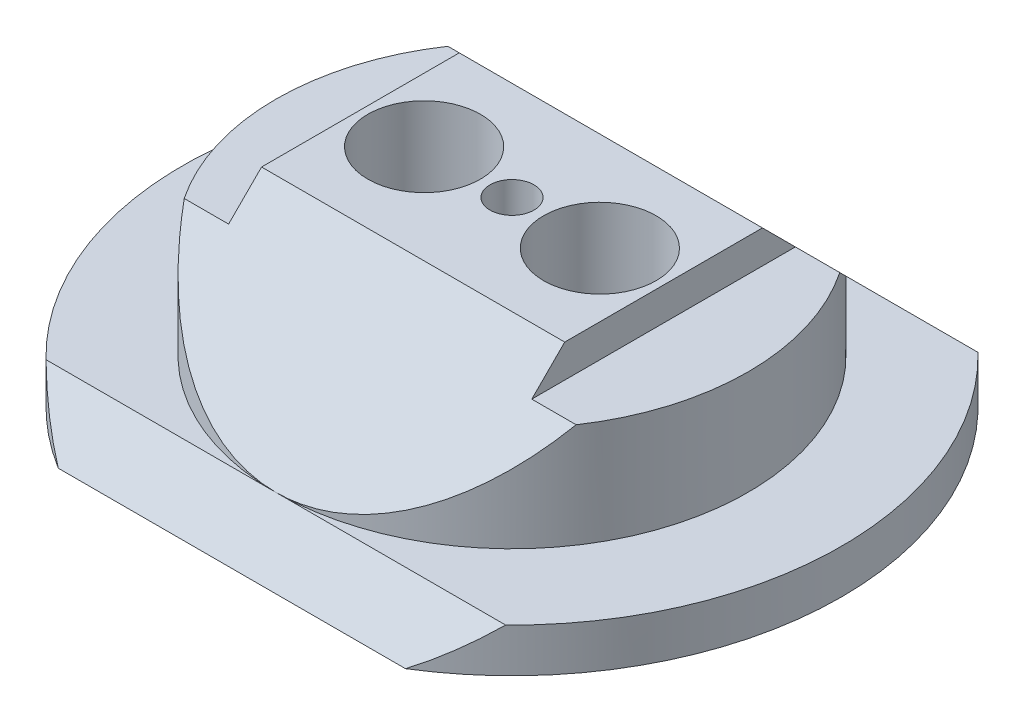
ISO-10303-21;
HEADER;
FILE_DESCRIPTION(('STEP AP214'),'2;1');
FILE_NAME('part.step','',(''),(''),'','','');
FILE_SCHEMA(('AUTOMOTIVE_DESIGN { 1 0 10303 214 1 1 1 1 }'));
ENDSEC;
DATA;
#1=APPLICATION_CONTEXT('core data for automotive mechanical design processes');
#2=APPLICATION_PROTOCOL_DEFINITION('international standard','automotive_design',2000,#1);
#3=PRODUCT_CONTEXT('',#1,'mechanical');
#4=PRODUCT('Part','Part','',(#3));
#5=PRODUCT_RELATED_PRODUCT_CATEGORY('part','',(#4));
#6=PRODUCT_DEFINITION_FORMATION('','',#4);
#7=PRODUCT_DEFINITION_CONTEXT('part definition',#1,'design');
#8=PRODUCT_DEFINITION('design','',#6,#7);
#9=PRODUCT_DEFINITION_SHAPE('','',#8);
#10=(LENGTH_UNIT() NAMED_UNIT(*) SI_UNIT(.MILLI.,.METRE.));
#11=(NAMED_UNIT(*) PLANE_ANGLE_UNIT() SI_UNIT($,.RADIAN.));
#12=(NAMED_UNIT(*) SI_UNIT($,.STERADIAN.) SOLID_ANGLE_UNIT());
#13=UNCERTAINTY_MEASURE_WITH_UNIT(LENGTH_MEASURE(1.E-05),#10,'distance_accuracy_value','');
#14=(GEOMETRIC_REPRESENTATION_CONTEXT(3) GLOBAL_UNCERTAINTY_ASSIGNED_CONTEXT((#13)) GLOBAL_UNIT_ASSIGNED_CONTEXT((#10,
#11,#12)) REPRESENTATION_CONTEXT('',''));
#15=CARTESIAN_POINT('',(0.,0.,0.));
#16=DIRECTION('',(0.,0.,1.));
#17=DIRECTION('',(1.,0.,0.));
#18=AXIS2_PLACEMENT_3D('',#15,#16,#17);
#19=CARTESIAN_POINT('',(0.,20.,0.));
#20=DIRECTION('',(0.,-1.,0.));
#21=DIRECTION('',(0.,0.,-1.));
#22=AXIS2_PLACEMENT_3D('',#19,#20,#21);
#23=CYLINDRICAL_SURFACE('',#22,1.5);
#24=CARTESIAN_POINT('',(0.,0.,0.));
#25=DIRECTION('',(0.,-1.,0.));
#26=DIRECTION('',(0.,0.,-1.));
#27=AXIS2_PLACEMENT_3D('',#24,#25,#26);
#28=CIRCLE('',#27,1.5);
#29=CARTESIAN_POINT('',(0.,0.,-1.5));
#30=VERTEX_POINT('',#29);
#31=EDGE_CURVE('E156',#30,#30,#28,.T.);
#32=ORIENTED_EDGE('',*,*,#31,.T.);
#33=EDGE_LOOP('',(#32));
#34=FACE_BOUND('',#33,.T.);
#35=CARTESIAN_POINT('',(0.,13.5,0.));
#36=DIRECTION('',(0.,1.,0.));
#37=DIRECTION('',(0.,0.,1.));
#38=AXIS2_PLACEMENT_3D('',#35,#36,#37);
#39=CIRCLE('',#38,1.5);
#40=CARTESIAN_POINT('',(0.,13.5,1.5));
#41=VERTEX_POINT('',#40);
#42=EDGE_CURVE('E63',#41,#41,#39,.F.);
#43=ORIENTED_EDGE('',*,*,#42,.F.);
#44=EDGE_LOOP('',(#43));
#45=FACE_BOUND('',#44,.T.);
#46=ADVANCED_FACE('F59',(#34,#45),#23,.F.);
#47=CARTESIAN_POINT('',(0.,0.,0.));
#48=DIRECTION('',(0.,1.,0.));
#49=DIRECTION('',(0.,0.,1.));
#50=AXIS2_PLACEMENT_3D('',#47,#48,#49);
#51=PLANE('',#50);
#52=CARTESIAN_POINT('',(-14.,0.,12.));
#53=DIRECTION('',(0.,-1.,0.));
#54=DIRECTION('',(0.,0.,-1.));
#55=AXIS2_PLACEMENT_3D('',#52,#53,#54);
#56=CIRCLE('',#55,5.);
#57=CARTESIAN_POINT('',(-14.,0.,7.));
#58=VERTEX_POINT('',#57);
#59=EDGE_CURVE('E686',#58,#58,#56,.T.);
#60=ORIENTED_EDGE('',*,*,#59,.F.);
#61=EDGE_LOOP('',(#60));
#62=FACE_BOUND('',#61,.T.);
#63=CARTESIAN_POINT('',(22.,0.,0.));
#64=DIRECTION('',(0.,-1.,0.));
#65=DIRECTION('',(0.,0.,-1.));
#66=AXIS2_PLACEMENT_3D('',#63,#64,#65);
#67=CIRCLE('',#66,5.);
#68=CARTESIAN_POINT('',(22.,0.,-5.));
#69=VERTEX_POINT('',#68);
#70=EDGE_CURVE('E685',#69,#69,#67,.T.);
#71=ORIENTED_EDGE('',*,*,#70,.F.);
#72=EDGE_LOOP('',(#71));
#73=FACE_BOUND('',#72,.T.);
#74=CARTESIAN_POINT('',(-22.,0.,0.));
#75=DIRECTION('',(0.,-1.,0.));
#76=DIRECTION('',(0.,0.,-1.));
#77=AXIS2_PLACEMENT_3D('',#74,#75,#76);
#78=CIRCLE('',#77,5.);
#79=CARTESIAN_POINT('',(-22.,0.,-5.));
#80=VERTEX_POINT('',#79);
#81=EDGE_CURVE('E706',#80,#80,#78,.T.);
#82=ORIENTED_EDGE('',*,*,#81,.F.);
#83=EDGE_LOOP('',(#82));
#84=FACE_BOUND('',#83,.T.);
#85=CARTESIAN_POINT('',(0.,0.,15.));
#86=DIRECTION('',(0.,-1.,0.));
#87=DIRECTION('',(0.,0.,-1.));
#88=AXIS2_PLACEMENT_3D('',#85,#86,#87);
#89=CIRCLE('',#88,5.);
#90=CARTESIAN_POINT('',(0.,0.,10.));
#91=VERTEX_POINT('',#90);
#92=EDGE_CURVE('E700',#91,#91,#89,.T.);
#93=ORIENTED_EDGE('',*,*,#92,.F.);
#94=EDGE_LOOP('',(#93));
#95=FACE_BOUND('',#94,.T.);
#96=CARTESIAN_POINT('',(14.,0.,-12.));
#97=DIRECTION('',(0.,-1.,0.));
#98=DIRECTION('',(0.,0.,-1.));
#99=AXIS2_PLACEMENT_3D('',#96,#97,#98);
#100=CIRCLE('',#99,5.);
#101=CARTESIAN_POINT('',(14.,0.,-17.));
#102=VERTEX_POINT('',#101);
#103=EDGE_CURVE('E763',#102,#102,#100,.T.);
#104=ORIENTED_EDGE('',*,*,#103,.F.);
#105=EDGE_LOOP('',(#104));
#106=FACE_BOUND('',#105,.T.);
#107=CARTESIAN_POINT('',(-14.,0.,-12.));
#108=DIRECTION('',(0.,-1.,0.));
#109=DIRECTION('',(0.,0.,-1.));
#110=AXIS2_PLACEMENT_3D('',#107,#108,#109);
#111=CIRCLE('',#110,5.);
#112=CARTESIAN_POINT('',(-14.,0.,-17.));
#113=VERTEX_POINT('',#112);
#114=EDGE_CURVE('E751',#113,#113,#111,.T.);
#115=ORIENTED_EDGE('',*,*,#114,.F.);
#116=EDGE_LOOP('',(#115));
#117=FACE_BOUND('',#116,.T.);
#118=CARTESIAN_POINT('',(14.,0.,12.));
#119=DIRECTION('',(0.,-1.,0.));
#120=DIRECTION('',(0.,0.,-1.));
#121=AXIS2_PLACEMENT_3D('',#118,#119,#120);
#122=CIRCLE('',#121,5.);
#123=CARTESIAN_POINT('',(14.,0.,7.));
#124=VERTEX_POINT('',#123);
#125=EDGE_CURVE('E758',#124,#124,#122,.T.);
#126=ORIENTED_EDGE('',*,*,#125,.F.);
#127=EDGE_LOOP('',(#126));
#128=FACE_BOUND('',#127,.T.);
#129=CARTESIAN_POINT('',(0.,0.,-15.));
#130=DIRECTION('',(0.,-1.,0.));
#131=DIRECTION('',(0.,0.,-1.));
#132=AXIS2_PLACEMENT_3D('',#129,#130,#131);
#133=CIRCLE('',#132,5.);
#134=CARTESIAN_POINT('',(0.,0.,-20.));
#135=VERTEX_POINT('',#134);
#136=EDGE_CURVE('E699',#135,#135,#133,.T.);
#137=ORIENTED_EDGE('',*,*,#136,.F.);
#138=EDGE_LOOP('',(#137));
#139=FACE_BOUND('',#138,.T.);
#140=ORIENTED_EDGE('',*,*,#31,.F.);
#141=EDGE_LOOP('',(#140));
#142=FACE_BOUND('',#141,.T.);
#143=CARTESIAN_POINT('',(-8.,0.,0.));
#144=DIRECTION('',(0.,1.,0.));
#145=DIRECTION('',(0.,0.,1.));
#146=AXIS2_PLACEMENT_3D('',#143,#144,#145);
#147=CIRCLE('',#146,5.125);
#148=CARTESIAN_POINT('',(-8.,0.,5.125));
#149=VERTEX_POINT('',#148);
#150=EDGE_CURVE('E186',#149,#149,#147,.T.);
#151=ORIENTED_EDGE('',*,*,#150,.T.);
#152=EDGE_LOOP('',(#151));
#153=FACE_BOUND('',#152,.T.);
#154=CARTESIAN_POINT('',(8.,0.,0.));
#155=DIRECTION('',(0.,1.,0.));
#156=DIRECTION('',(0.,0.,1.));
#157=AXIS2_PLACEMENT_3D('',#154,#155,#156);
#158=CIRCLE('',#157,5.125);
#159=CARTESIAN_POINT('',(8.,0.,5.125));
#160=VERTEX_POINT('',#159);
#161=EDGE_CURVE('E181',#160,#160,#158,.T.);
#162=ORIENTED_EDGE('',*,*,#161,.T.);
#163=EDGE_LOOP('',(#162));
#164=FACE_BOUND('',#163,.T.);
#165=DIRECTION('',(1.,0.,0.));
#166=VECTOR('',#165,1.);
#167=CARTESIAN_POINT('',(0.,0.,25.5));
#168=LINE('',#167,#166);
#169=CARTESIAN_POINT('',(-15.8034806292791,0.,25.5));
#170=VERTEX_POINT('',#169);
#171=CARTESIAN_POINT('',(15.8034806292791,0.,25.5));
#172=VERTEX_POINT('',#171);
#173=EDGE_CURVE('E203',#170,#172,#168,.T.);
#174=ORIENTED_EDGE('',*,*,#173,.F.);
#175=CARTESIAN_POINT('',(0.,0.,0.));
#176=DIRECTION('',(0.,1.,0.));
#177=DIRECTION('',(0.,0.,1.));
#178=AXIS2_PLACEMENT_3D('',#175,#176,#177);
#179=CIRCLE('',#178,30.);
#180=CARTESIAN_POINT('',(-15.8034806292789,0.,-25.5000000000001));
#181=VERTEX_POINT('',#180);
#182=EDGE_CURVE('E225',#181,#170,#179,.T.);
#183=ORIENTED_EDGE('',*,*,#182,.F.);
#184=DIRECTION('',(-1.,0.,0.));
#185=VECTOR('',#184,1.);
#186=CARTESIAN_POINT('',(0.,0.,-25.5000000000001));
#187=LINE('',#186,#185);
#188=CARTESIAN_POINT('',(15.8034806292789,0.,-25.5000000000001));
#189=VERTEX_POINT('',#188);
#190=EDGE_CURVE('E206',#189,#181,#187,.T.);
#191=ORIENTED_EDGE('',*,*,#190,.F.);
#192=EDGE_CURVE('E217',#172,#189,#179,.T.);
#193=ORIENTED_EDGE('',*,*,#192,.F.);
#194=EDGE_LOOP('',(#174,#183,#191,#193));
#195=FACE_BOUND('',#194,.T.);
#196=ADVANCED_FACE('F273',(#62,#73,#84,#95,#106,#117,#128,#139,#142,#153,#164,#195),#51,.F.);
#197=CARTESIAN_POINT('',(0.,4.,0.));
#198=DIRECTION('',(0.,-1.,0.));
#199=DIRECTION('',(0.,0.,-1.));
#200=AXIS2_PLACEMENT_3D('',#197,#198,#199);
#201=CYLINDRICAL_SURFACE('',#200,30.);
#202=CARTESIAN_POINT('',(0.,4.,0.));
#203=DIRECTION('',(0.,1.,0.));
#204=DIRECTION('',(0.,0.,1.));
#205=AXIS2_PLACEMENT_3D('',#202,#203,#204);
#206=CIRCLE('',#205,30.);
#207=CARTESIAN_POINT('',(20.9224759529077,4.,21.5));
#208=VERTEX_POINT('',#207);
#209=CARTESIAN_POINT('',(20.9224759529077,4.,-21.5));
#210=VERTEX_POINT('',#209);
#211=EDGE_CURVE('E198',#208,#210,#206,.T.);
#212=ORIENTED_EDGE('',*,*,#211,.F.);
#213=CARTESIAN_POINT('',(0.,25.4999999999998,0.));
#214=DIRECTION('',(0.,-0.707106781186551,-0.707106781186544));
#215=DIRECTION('',(0.,-0.707106781186544,0.707106781186551));
#216=AXIS2_PLACEMENT_3D('',#213,#214,#215);
#217=ELLIPSE('',#216,42.4264068711926,30.);
#218=EDGE_CURVE('E218',#172,#208,#217,.F.);
#219=ORIENTED_EDGE('',*,*,#218,.F.);
#220=ORIENTED_EDGE('',*,*,#192,.T.);
#221=CARTESIAN_POINT('',(0.,25.4999999999995,0.));
#222=DIRECTION('',(0.,-0.707106781186556,0.707106781186539));
#223=DIRECTION('',(0.,-0.707106781186539,-0.707106781186556));
#224=AXIS2_PLACEMENT_3D('',#221,#222,#223);
#225=ELLIPSE('',#224,42.4264068711924,30.);
#226=EDGE_CURVE('E215',#210,#189,#225,.F.);
#227=ORIENTED_EDGE('',*,*,#226,.F.);
#228=EDGE_LOOP('',(#212,#219,#220,#227));
#229=FACE_BOUND('',#228,.T.);
#230=ADVANCED_FACE('F61',(#229),#201,.T.);
#231=CARTESIAN_POINT('',(0.,4.,0.));
#232=DIRECTION('',(0.,1.,0.));
#233=DIRECTION('',(0.,0.,1.));
#234=AXIS2_PLACEMENT_3D('',#231,#232,#233);
#235=CIRCLE('',#234,30.);
#236=CARTESIAN_POINT('',(-20.9224759529077,4.,-21.5));
#237=VERTEX_POINT('',#236);
#238=CARTESIAN_POINT('',(-20.9224759529077,4.,21.5));
#239=VERTEX_POINT('',#238);
#240=EDGE_CURVE('E196',#237,#239,#235,.T.);
#241=ORIENTED_EDGE('',*,*,#240,.F.);
#242=CARTESIAN_POINT('',(0.,25.4999999999995,0.));
#243=DIRECTION('',(0.,0.707106781186556,-0.707106781186539));
#244=DIRECTION('',(0.,-0.707106781186539,-0.707106781186556));
#245=AXIS2_PLACEMENT_3D('',#242,#243,#244);
#246=ELLIPSE('',#245,42.4264068711924,30.);
#247=EDGE_CURVE('E209',#237,#181,#246,.F.);
#248=ORIENTED_EDGE('',*,*,#247,.T.);
#249=ORIENTED_EDGE('',*,*,#182,.T.);
#250=CARTESIAN_POINT('',(0.,25.4999999999998,0.));
#251=DIRECTION('',(0.,0.707106781186551,0.707106781186544));
#252=DIRECTION('',(0.,-0.707106781186544,0.707106781186551));
#253=AXIS2_PLACEMENT_3D('',#250,#251,#252);
#254=ELLIPSE('',#253,42.4264068711926,30.);
#255=EDGE_CURVE('E211',#170,#239,#254,.F.);
#256=ORIENTED_EDGE('',*,*,#255,.T.);
#257=EDGE_LOOP('',(#241,#248,#249,#256));
#258=FACE_BOUND('',#257,.T.);
#259=ADVANCED_FACE('F279',(#258),#201,.T.);
#260=CARTESIAN_POINT('',(30.001,16.5,8.99999999999987));
#261=DIRECTION('',(0.,-0.707106781186551,-0.707106781186544));
#262=DIRECTION('',(0.,0.707106781186544,-0.707106781186551));
#263=AXIS2_PLACEMENT_3D('',#260,#261,#262);
#264=PLANE('',#263);
#265=DIRECTION('',(1.,0.,0.));
#266=VECTOR('',#265,1.);
#267=CARTESIAN_POINT('',(30.001,4.,21.5));
#268=LINE('',#267,#266);
#269=CARTESIAN_POINT('',(0.,3.99999999999999,21.5));
#270=VERTEX_POINT('',#269);
#271=EDGE_CURVE('E202',#239,#270,#268,.T.);
#272=ORIENTED_EDGE('',*,*,#271,.F.);
#273=ORIENTED_EDGE('',*,*,#255,.F.);
#274=ORIENTED_EDGE('',*,*,#173,.T.);
#275=ORIENTED_EDGE('',*,*,#218,.T.);
#276=EDGE_CURVE('E200',#270,#208,#268,.T.);
#277=ORIENTED_EDGE('',*,*,#276,.F.);
#278=EDGE_LOOP('',(#272,#273,#274,#275,#277));
#279=FACE_BOUND('',#278,.T.);
#280=ADVANCED_FACE('F265',(#279),#264,.F.);
#281=CARTESIAN_POINT('',(30.001,16.5,-8.99999999999971));
#282=DIRECTION('',(0.,-0.707106781186556,0.707106781186539));
#283=DIRECTION('',(0.,-0.707106781186539,-0.707106781186556));
#284=AXIS2_PLACEMENT_3D('',#281,#282,#283);
#285=PLANE('',#284);
#286=DIRECTION('',(-1.,0.,0.));
#287=VECTOR('',#286,1.);
#288=CARTESIAN_POINT('',(30.001,4.,-21.5));
#289=LINE('',#288,#287);
#290=CARTESIAN_POINT('',(0.,4.,-21.5));
#291=VERTEX_POINT('',#290);
#292=EDGE_CURVE('E232',#210,#291,#289,.T.);
#293=ORIENTED_EDGE('',*,*,#292,.F.);
#294=ORIENTED_EDGE('',*,*,#226,.T.);
#295=ORIENTED_EDGE('',*,*,#190,.T.);
#296=ORIENTED_EDGE('',*,*,#247,.F.);
#297=EDGE_CURVE('E230',#291,#237,#289,.T.);
#298=ORIENTED_EDGE('',*,*,#297,.F.);
#299=EDGE_LOOP('',(#293,#294,#295,#296,#298));
#300=FACE_BOUND('',#299,.T.);
#301=ADVANCED_FACE('F277',(#300),#285,.F.);
#302=CARTESIAN_POINT('',(0.,96.0338927753446,0.));
#303=DIRECTION('',(0.,-1.,0.));
#304=DIRECTION('',(0.,0.,-1.));
#305=AXIS2_PLACEMENT_3D('',#302,#303,#304);
#306=CYLINDRICAL_SURFACE('',#305,21.5);
#307=CARTESIAN_POINT('',(0.,13.5,0.));
#308=DIRECTION('',(0.,-1.,0.));
#309=DIRECTION('',(1.,0.,0.));
#310=AXIS2_PLACEMENT_3D('',#307,#308,#309);
#311=CIRCLE('',#310,21.5);
#312=CARTESIAN_POINT('',(17.8395627749114,13.5,-11.9999999999998));
#313=VERTEX_POINT('',#312);
#314=CARTESIAN_POINT('',(17.8395627749114,13.5,11.9999999999999));
#315=VERTEX_POINT('',#314);
#316=EDGE_CURVE('E172',#313,#315,#311,.T.);
#317=ORIENTED_EDGE('',*,*,#316,.T.);
#318=CARTESIAN_POINT('',(0.,25.4999999999998,0.));
#319=DIRECTION('',(0.,-0.707106781186551,-0.707106781186544));
#320=DIRECTION('',(0.,-0.707106781186544,0.707106781186551));
#321=AXIS2_PLACEMENT_3D('',#318,#319,#320);
#322=ELLIPSE('',#321,30.4055915910214,21.5);
#323=EDGE_CURVE('E195',#270,#315,#322,.F.);
#324=ORIENTED_EDGE('',*,*,#323,.F.);
#325=CARTESIAN_POINT('',(0.,4.,0.));
#326=DIRECTION('',(0.,1.,0.));
#327=DIRECTION('',(0.,0.,1.));
#328=AXIS2_PLACEMENT_3D('',#325,#326,#327);
#329=CIRCLE('',#328,21.5);
#330=EDGE_CURVE('E190',#270,#291,#329,.T.);
#331=ORIENTED_EDGE('',*,*,#330,.T.);
#332=CARTESIAN_POINT('',(0.,25.4999999999995,0.));
#333=DIRECTION('',(0.,-0.707106781186556,0.707106781186539));
#334=DIRECTION('',(0.,-0.707106781186539,-0.707106781186556));
#335=AXIS2_PLACEMENT_3D('',#332,#333,#334);
#336=ELLIPSE('',#335,30.4055915910212,21.5);
#337=EDGE_CURVE('E228',#313,#291,#336,.F.);
#338=ORIENTED_EDGE('',*,*,#337,.F.);
#339=EDGE_LOOP('',(#317,#324,#331,#338));
#340=FACE_BOUND('',#339,.T.);
#341=ADVANCED_FACE('F257',(#340),#306,.T.);
#342=CARTESIAN_POINT('',(0.,4.,0.));
#343=DIRECTION('',(0.,1.,0.));
#344=DIRECTION('',(0.,0.,1.));
#345=AXIS2_PLACEMENT_3D('',#342,#343,#344);
#346=PLANE('',#345);
#347=ORIENTED_EDGE('',*,*,#276,.T.);
#348=ORIENTED_EDGE('',*,*,#211,.T.);
#349=ORIENTED_EDGE('',*,*,#292,.T.);
#350=ORIENTED_EDGE('',*,*,#330,.F.);
#351=EDGE_LOOP('',(#347,#348,#349,#350));
#352=FACE_BOUND('',#351,.T.);
#353=ADVANCED_FACE('F262',(#352),#346,.T.);
#354=ORIENTED_EDGE('',*,*,#271,.T.);
#355=EDGE_CURVE('E189',#291,#270,#329,.T.);
#356=ORIENTED_EDGE('',*,*,#355,.F.);
#357=ORIENTED_EDGE('',*,*,#297,.T.);
#358=ORIENTED_EDGE('',*,*,#240,.T.);
#359=EDGE_LOOP('',(#354,#356,#357,#358));
#360=FACE_BOUND('',#359,.T.);
#361=ADVANCED_FACE('F251',(#360),#346,.T.);
#362=CARTESIAN_POINT('',(-17.8395627749113,13.5,11.9999999999999));
#363=VERTEX_POINT('',#362);
#364=EDGE_CURVE('E193',#363,#270,#322,.F.);
#365=ORIENTED_EDGE('',*,*,#364,.F.);
#366=CARTESIAN_POINT('',(0.,13.5,0.));
#367=DIRECTION('',(0.,-1.,0.));
#368=DIRECTION('',(0.,0.,-1.));
#369=AXIS2_PLACEMENT_3D('',#366,#367,#368);
#370=CIRCLE('',#369,21.5);
#371=CARTESIAN_POINT('',(-17.8395627749114,13.5,-11.9999999999998));
#372=VERTEX_POINT('',#371);
#373=EDGE_CURVE('E75',#363,#372,#370,.T.);
#374=ORIENTED_EDGE('',*,*,#373,.T.);
#375=EDGE_CURVE('E161',#291,#372,#336,.F.);
#376=ORIENTED_EDGE('',*,*,#375,.F.);
#377=ORIENTED_EDGE('',*,*,#355,.T.);
#378=EDGE_LOOP('',(#365,#374,#376,#377));
#379=FACE_BOUND('',#378,.T.);
#380=ADVANCED_FACE('F244',(#379),#306,.T.);
#381=DIRECTION('',(1.,0.,0.));
#382=VECTOR('',#381,1.);
#383=CARTESIAN_POINT('',(30.001,13.5,-11.9999999999998));
#384=LINE('',#383,#382);
#385=CARTESIAN_POINT('',(-13.8,13.5,-11.9999999999998));
#386=VERTEX_POINT('',#385);
#387=EDGE_CURVE('E153',#372,#386,#384,.T.);
#388=ORIENTED_EDGE('',*,*,#387,.T.);
#389=DIRECTION('',(0.,0.707106781186539,0.707106781186556));
#390=VECTOR('',#389,1.);
#391=CARTESIAN_POINT('',(-13.8,16.5,-8.99999999999971));
#392=LINE('',#391,#390);
#393=CARTESIAN_POINT('',(-13.8,16.5,-8.99999999999971));
#394=VERTEX_POINT('',#393);
#395=EDGE_CURVE('E143',#386,#394,#392,.T.);
#396=ORIENTED_EDGE('',*,*,#395,.T.);
#397=DIRECTION('',(-1.,0.,0.));
#398=VECTOR('',#397,1.);
#399=CARTESIAN_POINT('',(30.001,16.5,-8.99999999999971));
#400=LINE('',#399,#398);
#401=CARTESIAN_POINT('',(13.8,16.5,-8.99999999999971));
#402=VERTEX_POINT('',#401);
#403=EDGE_CURVE('E221',#402,#394,#400,.T.);
#404=ORIENTED_EDGE('',*,*,#403,.F.);
#405=DIRECTION('',(0.,-0.707106781186539,-0.707106781186556));
#406=VECTOR('',#405,1.);
#407=CARTESIAN_POINT('',(13.8,16.5,-8.99999999999971));
#408=LINE('',#407,#406);
#409=CARTESIAN_POINT('',(13.8,13.5,-11.9999999999998));
#410=VERTEX_POINT('',#409);
#411=EDGE_CURVE('E168',#402,#410,#408,.T.);
#412=ORIENTED_EDGE('',*,*,#411,.T.);
#413=DIRECTION('',(1.,0.,0.));
#414=VECTOR('',#413,1.);
#415=CARTESIAN_POINT('',(30.001,13.5,-11.9999999999998));
#416=LINE('',#415,#414);
#417=EDGE_CURVE('E174',#410,#313,#416,.T.);
#418=ORIENTED_EDGE('',*,*,#417,.T.);
#419=ORIENTED_EDGE('',*,*,#337,.T.);
#420=ORIENTED_EDGE('',*,*,#375,.T.);
#421=EDGE_LOOP('',(#388,#396,#404,#412,#418,#419,#420));
#422=FACE_BOUND('',#421,.T.);
#423=ADVANCED_FACE('F159',(#422),#285,.F.);
#424=CARTESIAN_POINT('',(30.001,16.5,8.99999999999987));
#425=DIRECTION('',(0.,-1.,0.));
#426=DIRECTION('',(0.,0.,-1.));
#427=AXIS2_PLACEMENT_3D('',#424,#425,#426);
#428=PLANE('',#427);
#429=CARTESIAN_POINT('',(0.,16.5,0.));
#430=DIRECTION('',(0.,1.,0.));
#431=DIRECTION('',(0.,0.,1.));
#432=AXIS2_PLACEMENT_3D('',#429,#430,#431);
#433=CIRCLE('',#432,2.);
#434=CARTESIAN_POINT('',(0.,16.5,2.00000000000001));
#435=VERTEX_POINT('',#434);
#436=EDGE_CURVE('E712',#435,#435,#433,.T.);
#437=ORIENTED_EDGE('',*,*,#436,.F.);
#438=EDGE_LOOP('',(#437));
#439=FACE_BOUND('',#438,.T.);
#440=CARTESIAN_POINT('',(-8.,16.5,0.));
#441=DIRECTION('',(0.,1.,0.));
#442=DIRECTION('',(0.,0.,1.));
#443=AXIS2_PLACEMENT_3D('',#440,#441,#442);
#444=CIRCLE('',#443,5.125);
#445=CARTESIAN_POINT('',(-8.,16.5,5.12500000000001));
#446=VERTEX_POINT('',#445);
#447=EDGE_CURVE('E178',#446,#446,#444,.T.);
#448=ORIENTED_EDGE('',*,*,#447,.F.);
#449=EDGE_LOOP('',(#448));
#450=FACE_BOUND('',#449,.T.);
#451=CARTESIAN_POINT('',(8.,16.5,0.));
#452=DIRECTION('',(0.,1.,0.));
#453=DIRECTION('',(0.,0.,1.));
#454=AXIS2_PLACEMENT_3D('',#451,#452,#453);
#455=CIRCLE('',#454,5.125);
#456=CARTESIAN_POINT('',(8.,16.5,5.12500000000001));
#457=VERTEX_POINT('',#456);
#458=EDGE_CURVE('E177',#457,#457,#455,.T.);
#459=ORIENTED_EDGE('',*,*,#458,.F.);
#460=EDGE_LOOP('',(#459));
#461=FACE_BOUND('',#460,.T.);
#462=ORIENTED_EDGE('',*,*,#403,.T.);
#463=DIRECTION('',(0.,0.,1.));
#464=VECTOR('',#463,1.);
#465=CARTESIAN_POINT('',(-13.8,16.5,-25.5000000000001));
#466=LINE('',#465,#464);
#467=CARTESIAN_POINT('',(-13.8,16.5,8.99999999999986));
#468=VERTEX_POINT('',#467);
#469=EDGE_CURVE('E148',#394,#468,#466,.T.);
#470=ORIENTED_EDGE('',*,*,#469,.T.);
#471=DIRECTION('',(-1.,0.,0.));
#472=VECTOR('',#471,1.);
#473=CARTESIAN_POINT('',(30.001,16.5,8.99999999999987));
#474=LINE('',#473,#472);
#475=CARTESIAN_POINT('',(13.8,16.5,8.99999999999987));
#476=VERTEX_POINT('',#475);
#477=EDGE_CURVE('E214',#476,#468,#474,.T.);
#478=ORIENTED_EDGE('',*,*,#477,.F.);
#479=DIRECTION('',(0.,0.,1.));
#480=VECTOR('',#479,1.);
#481=CARTESIAN_POINT('',(13.8,16.5,-25.5000000000001));
#482=LINE('',#481,#480);
#483=EDGE_CURVE('E83',#402,#476,#482,.T.);
#484=ORIENTED_EDGE('',*,*,#483,.F.);
#485=EDGE_LOOP('',(#462,#470,#478,#484));
#486=FACE_BOUND('',#485,.T.);
#487=ADVANCED_FACE('F324',(#439,#450,#461,#486),#428,.F.);
#488=ORIENTED_EDGE('',*,*,#477,.T.);
#489=DIRECTION('',(0.,-0.707106781186544,0.707106781186551));
#490=VECTOR('',#489,1.);
#491=CARTESIAN_POINT('',(-13.8,16.5,8.99999999999987));
#492=LINE('',#491,#490);
#493=CARTESIAN_POINT('',(-13.8,13.5,11.9999999999999));
#494=VERTEX_POINT('',#493);
#495=EDGE_CURVE('E13',#468,#494,#492,.T.);
#496=ORIENTED_EDGE('',*,*,#495,.T.);
#497=DIRECTION('',(-1.,0.,0.));
#498=VECTOR('',#497,1.);
#499=CARTESIAN_POINT('',(30.001,13.5,11.9999999999999));
#500=LINE('',#499,#498);
#501=EDGE_CURVE('E68',#494,#363,#500,.T.);
#502=ORIENTED_EDGE('',*,*,#501,.T.);
#503=ORIENTED_EDGE('',*,*,#364,.T.);
#504=ORIENTED_EDGE('',*,*,#323,.T.);
#505=DIRECTION('',(-1.,0.,0.));
#506=VECTOR('',#505,1.);
#507=CARTESIAN_POINT('',(30.001,13.5,11.9999999999999));
#508=LINE('',#507,#506);
#509=CARTESIAN_POINT('',(13.8,13.5,11.9999999999999));
#510=VERTEX_POINT('',#509);
#511=EDGE_CURVE('E235',#315,#510,#508,.T.);
#512=ORIENTED_EDGE('',*,*,#511,.T.);
#513=DIRECTION('',(0.,0.707106781186544,-0.707106781186551));
#514=VECTOR('',#513,1.);
#515=CARTESIAN_POINT('',(13.8,16.5,8.99999999999987));
#516=LINE('',#515,#514);
#517=EDGE_CURVE('E233',#510,#476,#516,.T.);
#518=ORIENTED_EDGE('',*,*,#517,.T.);
#519=EDGE_LOOP('',(#488,#496,#502,#503,#504,#512,#518));
#520=FACE_BOUND('',#519,.T.);
#521=ADVANCED_FACE('F240',(#520),#264,.F.);
#522=CARTESIAN_POINT('',(8.,-7.50000000000001,0.));
#523=DIRECTION('',(0.,1.,0.));
#524=DIRECTION('',(0.,0.,1.));
#525=AXIS2_PLACEMENT_3D('',#522,#523,#524);
#526=CYLINDRICAL_SURFACE('',#525,5.125);
#527=ORIENTED_EDGE('',*,*,#458,.T.);
#528=EDGE_LOOP('',(#527));
#529=FACE_BOUND('',#528,.T.);
#530=ORIENTED_EDGE('',*,*,#161,.F.);
#531=EDGE_LOOP('',(#530));
#532=FACE_BOUND('',#531,.T.);
#533=ADVANCED_FACE('F314',(#529,#532),#526,.F.);
#534=CARTESIAN_POINT('',(-8.,-7.50000000000001,0.));
#535=DIRECTION('',(0.,1.,0.));
#536=DIRECTION('',(0.,0.,1.));
#537=AXIS2_PLACEMENT_3D('',#534,#535,#536);
#538=CYLINDRICAL_SURFACE('',#537,5.125);
#539=ORIENTED_EDGE('',*,*,#447,.T.);
#540=EDGE_LOOP('',(#539));
#541=FACE_BOUND('',#540,.T.);
#542=ORIENTED_EDGE('',*,*,#150,.F.);
#543=EDGE_LOOP('',(#542));
#544=FACE_BOUND('',#543,.T.);
#545=ADVANCED_FACE('F308',(#541,#544),#538,.F.);
#546=CARTESIAN_POINT('',(21.5,13.5,-25.5000000000001));
#547=DIRECTION('',(0.,-1.,0.));
#548=DIRECTION('',(1.,0.,0.));
#549=AXIS2_PLACEMENT_3D('',#546,#547,#548);
#550=PLANE('',#549);
#551=DIRECTION('',(0.,0.,1.));
#552=VECTOR('',#551,1.);
#553=CARTESIAN_POINT('',(13.8,13.5,-25.5000000000001));
#554=LINE('',#553,#552);
#555=EDGE_CURVE('E165',#410,#510,#554,.T.);
#556=ORIENTED_EDGE('',*,*,#555,.T.);
#557=ORIENTED_EDGE('',*,*,#511,.F.);
#558=ORIENTED_EDGE('',*,*,#316,.F.);
#559=ORIENTED_EDGE('',*,*,#417,.F.);
#560=EDGE_LOOP('',(#556,#557,#558,#559));
#561=FACE_BOUND('',#560,.T.);
#562=ADVANCED_FACE('F305',(#561),#550,.F.);
#563=CARTESIAN_POINT('',(13.8,13.5,-25.5000000000001));
#564=DIRECTION('',(-1.,0.,0.));
#565=DIRECTION('',(0.,0.,1.));
#566=AXIS2_PLACEMENT_3D('',#563,#564,#565);
#567=PLANE('',#566);
#568=ORIENTED_EDGE('',*,*,#483,.T.);
#569=ORIENTED_EDGE('',*,*,#517,.F.);
#570=ORIENTED_EDGE('',*,*,#555,.F.);
#571=ORIENTED_EDGE('',*,*,#411,.F.);
#572=EDGE_LOOP('',(#568,#569,#570,#571));
#573=FACE_BOUND('',#572,.T.);
#574=ADVANCED_FACE('F301',(#573),#567,.F.);
#575=CARTESIAN_POINT('',(-13.8,13.5,-25.5000000000001));
#576=DIRECTION('',(1.,0.,0.));
#577=DIRECTION('',(0.,0.,-1.));
#578=AXIS2_PLACEMENT_3D('',#575,#576,#577);
#579=PLANE('',#578);
#580=DIRECTION('',(0.,0.,1.));
#581=VECTOR('',#580,1.);
#582=CARTESIAN_POINT('',(-13.8,13.5,-25.5000000000001));
#583=LINE('',#582,#581);
#584=EDGE_CURVE('E146',#386,#494,#583,.T.);
#585=ORIENTED_EDGE('',*,*,#584,.T.);
#586=ORIENTED_EDGE('',*,*,#495,.F.);
#587=ORIENTED_EDGE('',*,*,#469,.F.);
#588=ORIENTED_EDGE('',*,*,#395,.F.);
#589=EDGE_LOOP('',(#585,#586,#587,#588));
#590=FACE_BOUND('',#589,.T.);
#591=ADVANCED_FACE('F145',(#590),#579,.F.);
#592=CARTESIAN_POINT('',(-21.5,13.5,-25.5000000000001));
#593=DIRECTION('',(0.,-1.,0.));
#594=DIRECTION('',(0.,0.,-1.));
#595=AXIS2_PLACEMENT_3D('',#592,#593,#594);
#596=PLANE('',#595);
#597=ORIENTED_EDGE('',*,*,#373,.F.);
#598=ORIENTED_EDGE('',*,*,#501,.F.);
#599=ORIENTED_EDGE('',*,*,#584,.F.);
#600=ORIENTED_EDGE('',*,*,#387,.F.);
#601=EDGE_LOOP('',(#597,#598,#599,#600));
#602=FACE_BOUND('',#601,.T.);
#603=ADVANCED_FACE('F155',(#602),#596,.F.);
#604=CARTESIAN_POINT('',(0.,13.5,0.));
#605=DIRECTION('',(0.,1.,0.));
#606=DIRECTION('',(0.,0.,1.));
#607=AXIS2_PLACEMENT_3D('',#604,#605,#606);
#608=PLANE('',#607);
#609=CARTESIAN_POINT('',(0.,13.5,0.));
#610=DIRECTION('',(0.,1.,0.));
#611=DIRECTION('',(0.,0.,1.));
#612=AXIS2_PLACEMENT_3D('',#609,#610,#611);
#613=CIRCLE('',#612,2.);
#614=CARTESIAN_POINT('',(0.,13.5,2.00000000000001));
#615=VERTEX_POINT('',#614);
#616=EDGE_CURVE('E715',#615,#615,#613,.T.);
#617=ORIENTED_EDGE('',*,*,#616,.T.);
#618=EDGE_LOOP('',(#617));
#619=FACE_BOUND('',#618,.T.);
#620=ORIENTED_EDGE('',*,*,#42,.T.);
#621=EDGE_LOOP('',(#620));
#622=FACE_BOUND('',#621,.T.);
#623=ADVANCED_FACE('F304',(#619,#622),#608,.T.);
#624=CARTESIAN_POINT('',(0.,13.5,0.));
#625=DIRECTION('',(0.,1.,0.));
#626=DIRECTION('',(0.,0.,1.));
#627=AXIS2_PLACEMENT_3D('',#624,#625,#626);
#628=CYLINDRICAL_SURFACE('',#627,2.);
#629=ORIENTED_EDGE('',*,*,#616,.F.);
#630=EDGE_LOOP('',(#629));
#631=FACE_BOUND('',#630,.T.);
#632=ORIENTED_EDGE('',*,*,#436,.T.);
#633=EDGE_LOOP('',(#632));
#634=FACE_BOUND('',#633,.T.);
#635=ADVANCED_FACE('F297',(#631,#634),#628,.F.);
#636=CARTESIAN_POINT('',(0.,3.,-15.));
#637=DIRECTION('',(0.,-1.,0.));
#638=DIRECTION('',(0.,0.,-1.));
#639=AXIS2_PLACEMENT_3D('',#636,#637,#638);
#640=CYLINDRICAL_SURFACE('',#639,5.);
#641=CARTESIAN_POINT('',(0.,3.,-15.));
#642=DIRECTION('',(0.,-1.,0.));
#643=DIRECTION('',(0.,0.,-1.));
#644=AXIS2_PLACEMENT_3D('',#641,#642,#643);
#645=CIRCLE('',#644,5.);
#646=CARTESIAN_POINT('',(0.,3.,-20.));
#647=VERTEX_POINT('',#646);
#648=EDGE_CURVE('E709',#647,#647,#645,.T.);
#649=ORIENTED_EDGE('',*,*,#648,.F.);
#650=EDGE_LOOP('',(#649));
#651=FACE_BOUND('',#650,.T.);
#652=ORIENTED_EDGE('',*,*,#136,.T.);
#653=EDGE_LOOP('',(#652));
#654=FACE_BOUND('',#653,.T.);
#655=ADVANCED_FACE('F398',(#651,#654),#640,.F.);
#656=CARTESIAN_POINT('',(0.,3.,-15.));
#657=DIRECTION('',(0.,-1.,0.));
#658=DIRECTION('',(0.,0.,-1.));
#659=AXIS2_PLACEMENT_3D('',#656,#657,#658);
#660=PLANE('',#659);
#661=ORIENTED_EDGE('',*,*,#648,.T.);
#662=EDGE_LOOP('',(#661));
#663=FACE_BOUND('',#662,.T.);
#664=ADVANCED_FACE('F407',(#663),#660,.T.);
#665=CARTESIAN_POINT('',(14.,3.,12.));
#666=DIRECTION('',(0.,-1.,0.));
#667=DIRECTION('',(0.,0.,-1.));
#668=AXIS2_PLACEMENT_3D('',#665,#666,#667);
#669=CYLINDRICAL_SURFACE('',#668,5.);
#670=CARTESIAN_POINT('',(14.,3.,12.));
#671=DIRECTION('',(0.,-1.,0.));
#672=DIRECTION('',(0.,0.,-1.));
#673=AXIS2_PLACEMENT_3D('',#670,#671,#672);
#674=CIRCLE('',#673,5.);
#675=CARTESIAN_POINT('',(14.,3.,7.));
#676=VERTEX_POINT('',#675);
#677=EDGE_CURVE('E692',#676,#676,#674,.T.);
#678=ORIENTED_EDGE('',*,*,#677,.F.);
#679=EDGE_LOOP('',(#678));
#680=FACE_BOUND('',#679,.T.);
#681=ORIENTED_EDGE('',*,*,#125,.T.);
#682=EDGE_LOOP('',(#681));
#683=FACE_BOUND('',#682,.T.);
#684=ADVANCED_FACE('F416',(#680,#683),#669,.F.);
#685=CARTESIAN_POINT('',(14.,3.,12.));
#686=DIRECTION('',(0.,-1.,0.));
#687=DIRECTION('',(0.,0.,-1.));
#688=AXIS2_PLACEMENT_3D('',#685,#686,#687);
#689=PLANE('',#688);
#690=ORIENTED_EDGE('',*,*,#677,.T.);
#691=EDGE_LOOP('',(#690));
#692=FACE_BOUND('',#691,.T.);
#693=ADVANCED_FACE('F425',(#692),#689,.T.);
#694=CARTESIAN_POINT('',(-14.,3.,-12.));
#695=DIRECTION('',(0.,-1.,0.));
#696=DIRECTION('',(0.,0.,-1.));
#697=AXIS2_PLACEMENT_3D('',#694,#695,#696);
#698=CYLINDRICAL_SURFACE('',#697,5.);
#699=CARTESIAN_POINT('',(-14.,3.,-12.));
#700=DIRECTION('',(0.,-1.,0.));
#701=DIRECTION('',(0.,0.,-1.));
#702=AXIS2_PLACEMENT_3D('',#699,#700,#701);
#703=CIRCLE('',#702,5.);
#704=CARTESIAN_POINT('',(-14.,3.,-17.));
#705=VERTEX_POINT('',#704);
#706=EDGE_CURVE('E754',#705,#705,#703,.T.);
#707=ORIENTED_EDGE('',*,*,#706,.F.);
#708=EDGE_LOOP('',(#707));
#709=FACE_BOUND('',#708,.T.);
#710=ORIENTED_EDGE('',*,*,#114,.T.);
#711=EDGE_LOOP('',(#710));
#712=FACE_BOUND('',#711,.T.);
#713=ADVANCED_FACE('F434',(#709,#712),#698,.F.);
#714=CARTESIAN_POINT('',(-14.,3.,-12.));
#715=DIRECTION('',(0.,-1.,0.));
#716=DIRECTION('',(0.,0.,-1.));
#717=AXIS2_PLACEMENT_3D('',#714,#715,#716);
#718=PLANE('',#717);
#719=ORIENTED_EDGE('',*,*,#706,.T.);
#720=EDGE_LOOP('',(#719));
#721=FACE_BOUND('',#720,.T.);
#722=ADVANCED_FACE('F443',(#721),#718,.T.);
#723=CARTESIAN_POINT('',(14.,3.,-12.));
#724=DIRECTION('',(0.,-1.,0.));
#725=DIRECTION('',(0.,0.,-1.));
#726=AXIS2_PLACEMENT_3D('',#723,#724,#725);
#727=CYLINDRICAL_SURFACE('',#726,5.);
#728=CARTESIAN_POINT('',(14.,3.,-12.));
#729=DIRECTION('',(0.,-1.,0.));
#730=DIRECTION('',(0.,0.,-1.));
#731=AXIS2_PLACEMENT_3D('',#728,#729,#730);
#732=CIRCLE('',#731,5.);
#733=CARTESIAN_POINT('',(14.,3.,-17.));
#734=VERTEX_POINT('',#733);
#735=EDGE_CURVE('E755',#734,#734,#732,.T.);
#736=ORIENTED_EDGE('',*,*,#735,.F.);
#737=EDGE_LOOP('',(#736));
#738=FACE_BOUND('',#737,.T.);
#739=ORIENTED_EDGE('',*,*,#103,.T.);
#740=EDGE_LOOP('',(#739));
#741=FACE_BOUND('',#740,.T.);
#742=ADVANCED_FACE('F452',(#738,#741),#727,.F.);
#743=CARTESIAN_POINT('',(14.,3.,-12.));
#744=DIRECTION('',(0.,-1.,0.));
#745=DIRECTION('',(0.,0.,-1.));
#746=AXIS2_PLACEMENT_3D('',#743,#744,#745);
#747=PLANE('',#746);
#748=ORIENTED_EDGE('',*,*,#735,.T.);
#749=EDGE_LOOP('',(#748));
#750=FACE_BOUND('',#749,.T.);
#751=ADVANCED_FACE('F461',(#750),#747,.T.);
#752=CARTESIAN_POINT('',(0.,3.,15.));
#753=DIRECTION('',(0.,-1.,0.));
#754=DIRECTION('',(0.,0.,-1.));
#755=AXIS2_PLACEMENT_3D('',#752,#753,#754);
#756=CYLINDRICAL_SURFACE('',#755,5.);
#757=CARTESIAN_POINT('',(0.,3.,15.));
#758=DIRECTION('',(0.,-1.,0.));
#759=DIRECTION('',(0.,0.,-1.));
#760=AXIS2_PLACEMENT_3D('',#757,#758,#759);
#761=CIRCLE('',#760,5.);
#762=CARTESIAN_POINT('',(0.,3.,10.));
#763=VERTEX_POINT('',#762);
#764=EDGE_CURVE('E696',#763,#763,#761,.T.);
#765=ORIENTED_EDGE('',*,*,#764,.F.);
#766=EDGE_LOOP('',(#765));
#767=FACE_BOUND('',#766,.T.);
#768=ORIENTED_EDGE('',*,*,#92,.T.);
#769=EDGE_LOOP('',(#768));
#770=FACE_BOUND('',#769,.T.);
#771=ADVANCED_FACE('F470',(#767,#770),#756,.F.);
#772=CARTESIAN_POINT('',(0.,3.,15.));
#773=DIRECTION('',(0.,-1.,0.));
#774=DIRECTION('',(0.,0.,-1.));
#775=AXIS2_PLACEMENT_3D('',#772,#773,#774);
#776=PLANE('',#775);
#777=ORIENTED_EDGE('',*,*,#764,.T.);
#778=EDGE_LOOP('',(#777));
#779=FACE_BOUND('',#778,.T.);
#780=ADVANCED_FACE('F479',(#779),#776,.T.);
#781=CARTESIAN_POINT('',(-22.,3.,0.));
#782=DIRECTION('',(0.,-1.,0.));
#783=DIRECTION('',(0.,0.,-1.));
#784=AXIS2_PLACEMENT_3D('',#781,#782,#783);
#785=CYLINDRICAL_SURFACE('',#784,5.);
#786=CARTESIAN_POINT('',(-22.,3.,0.));
#787=DIRECTION('',(0.,-1.,0.));
#788=DIRECTION('',(0.,0.,-1.));
#789=AXIS2_PLACEMENT_3D('',#786,#787,#788);
#790=CIRCLE('',#789,5.);
#791=CARTESIAN_POINT('',(-22.,3.,-5.));
#792=VERTEX_POINT('',#791);
#793=EDGE_CURVE('E703',#792,#792,#790,.T.);
#794=ORIENTED_EDGE('',*,*,#793,.F.);
#795=EDGE_LOOP('',(#794));
#796=FACE_BOUND('',#795,.T.);
#797=ORIENTED_EDGE('',*,*,#81,.T.);
#798=EDGE_LOOP('',(#797));
#799=FACE_BOUND('',#798,.T.);
#800=ADVANCED_FACE('F488',(#796,#799),#785,.F.);
#801=CARTESIAN_POINT('',(-22.,3.,0.));
#802=DIRECTION('',(0.,-1.,0.));
#803=DIRECTION('',(0.,0.,-1.));
#804=AXIS2_PLACEMENT_3D('',#801,#802,#803);
#805=PLANE('',#804);
#806=ORIENTED_EDGE('',*,*,#793,.T.);
#807=EDGE_LOOP('',(#806));
#808=FACE_BOUND('',#807,.T.);
#809=ADVANCED_FACE('F497',(#808),#805,.T.);
#810=CARTESIAN_POINT('',(22.,3.,0.));
#811=DIRECTION('',(0.,-1.,0.));
#812=DIRECTION('',(0.,0.,-1.));
#813=AXIS2_PLACEMENT_3D('',#810,#811,#812);
#814=CYLINDRICAL_SURFACE('',#813,5.);
#815=CARTESIAN_POINT('',(22.,3.,0.));
#816=DIRECTION('',(0.,-1.,0.));
#817=DIRECTION('',(0.,0.,-1.));
#818=AXIS2_PLACEMENT_3D('',#815,#816,#817);
#819=CIRCLE('',#818,5.);
#820=CARTESIAN_POINT('',(22.,3.,-5.));
#821=VERTEX_POINT('',#820);
#822=EDGE_CURVE('E689',#821,#821,#819,.T.);
#823=ORIENTED_EDGE('',*,*,#822,.F.);
#824=EDGE_LOOP('',(#823));
#825=FACE_BOUND('',#824,.T.);
#826=ORIENTED_EDGE('',*,*,#70,.T.);
#827=EDGE_LOOP('',(#826));
#828=FACE_BOUND('',#827,.T.);
#829=ADVANCED_FACE('F506',(#825,#828),#814,.F.);
#830=CARTESIAN_POINT('',(22.,3.,0.));
#831=DIRECTION('',(0.,-1.,0.));
#832=DIRECTION('',(0.,0.,-1.));
#833=AXIS2_PLACEMENT_3D('',#830,#831,#832);
#834=PLANE('',#833);
#835=ORIENTED_EDGE('',*,*,#822,.T.);
#836=EDGE_LOOP('',(#835));
#837=FACE_BOUND('',#836,.T.);
#838=ADVANCED_FACE('F515',(#837),#834,.T.);
#839=CARTESIAN_POINT('',(-14.,3.,12.));
#840=DIRECTION('',(0.,-1.,0.));
#841=DIRECTION('',(0.,0.,-1.));
#842=AXIS2_PLACEMENT_3D('',#839,#840,#841);
#843=CYLINDRICAL_SURFACE('',#842,5.);
#844=CARTESIAN_POINT('',(-14.,3.,12.));
#845=DIRECTION('',(0.,-1.,0.));
#846=DIRECTION('',(0.,0.,-1.));
#847=AXIS2_PLACEMENT_3D('',#844,#845,#846);
#848=CIRCLE('',#847,5.);
#849=CARTESIAN_POINT('',(-14.,3.,7.));
#850=VERTEX_POINT('',#849);
#851=EDGE_CURVE('E684',#850,#850,#848,.T.);
#852=ORIENTED_EDGE('',*,*,#851,.F.);
#853=EDGE_LOOP('',(#852));
#854=FACE_BOUND('',#853,.T.);
#855=ORIENTED_EDGE('',*,*,#59,.T.);
#856=EDGE_LOOP('',(#855));
#857=FACE_BOUND('',#856,.T.);
#858=ADVANCED_FACE('F524',(#854,#857),#843,.F.);
#859=CARTESIAN_POINT('',(-14.,3.,12.));
#860=DIRECTION('',(0.,-1.,0.));
#861=DIRECTION('',(0.,0.,-1.));
#862=AXIS2_PLACEMENT_3D('',#859,#860,#861);
#863=PLANE('',#862);
#864=ORIENTED_EDGE('',*,*,#851,.T.);
#865=EDGE_LOOP('',(#864));
#866=FACE_BOUND('',#865,.T.);
#867=ADVANCED_FACE('F533',(#866),#863,.T.);
#868=CLOSED_SHELL('',(#46,#196,#230,#259,#280,#301,#341,#353,#361,#380,#423,#487,#521,#533,#545,
#562,#574,#591,#603,#623,#635,#655,#664,#684,#693,#713,#722,#742,#751,#771,#780,#800,#809,#829,
#838,#858,#867));
#869=MANIFOLD_SOLID_BREP('B2',#868);
#870=ADVANCED_BREP_SHAPE_REPRESENTATION('',(#18,#869),#14);
#871=SHAPE_DEFINITION_REPRESENTATION(#9,#870);
ENDSEC;
END-ISO-10303-21;
